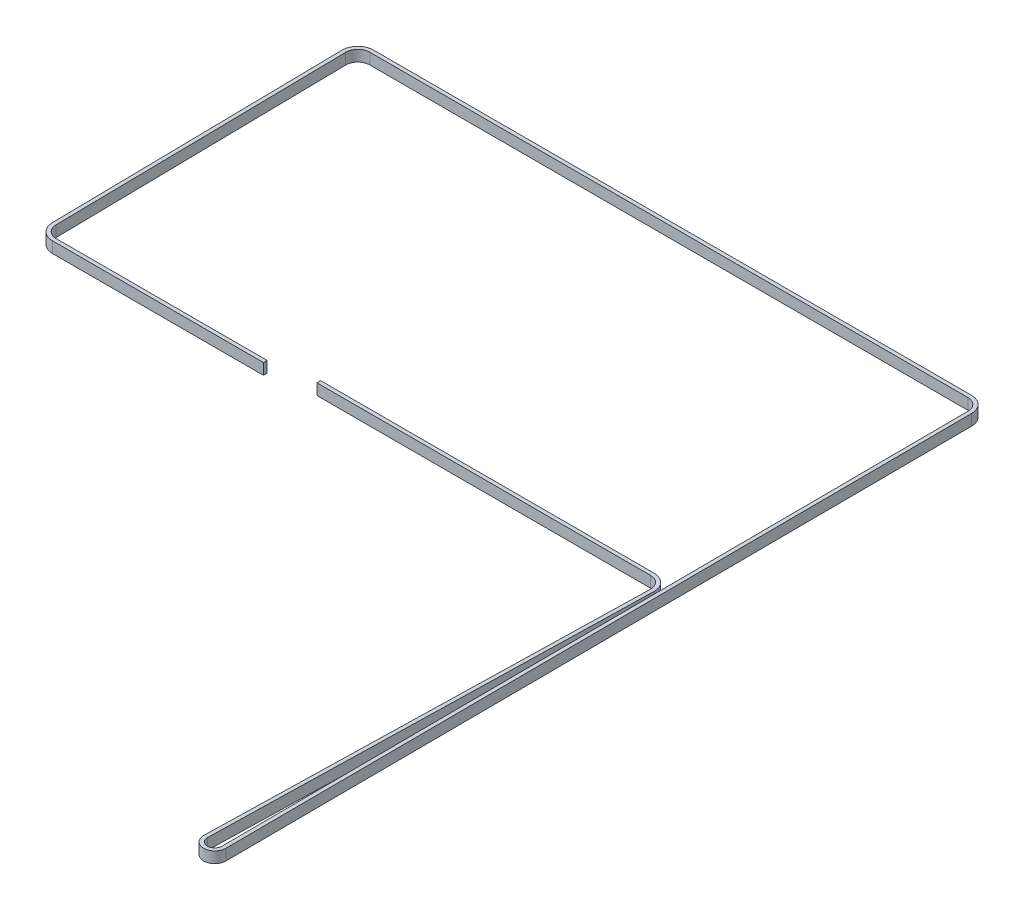
ISO-10303-21;
HEADER;
FILE_DESCRIPTION(('STEP AP214'),'2;1');
FILE_NAME('part.step','',(''),(''),'','','');
FILE_SCHEMA(('AUTOMOTIVE_DESIGN { 1 0 10303 214 1 1 1 1 }'));
ENDSEC;
DATA;
#1=APPLICATION_CONTEXT('core data for automotive mechanical design processes');
#2=APPLICATION_PROTOCOL_DEFINITION('international standard','automotive_design',2000,#1);
#3=PRODUCT_CONTEXT('',#1,'mechanical');
#4=PRODUCT('Part','Part','',(#3));
#5=PRODUCT_RELATED_PRODUCT_CATEGORY('part','',(#4));
#6=PRODUCT_DEFINITION_FORMATION('','',#4);
#7=PRODUCT_DEFINITION_CONTEXT('part definition',#1,'design');
#8=PRODUCT_DEFINITION('design','',#6,#7);
#9=PRODUCT_DEFINITION_SHAPE('','',#8);
#10=(LENGTH_UNIT() NAMED_UNIT(*) SI_UNIT(.MILLI.,.METRE.));
#11=(NAMED_UNIT(*) PLANE_ANGLE_UNIT() SI_UNIT($,.RADIAN.));
#12=(NAMED_UNIT(*) SI_UNIT($,.STERADIAN.) SOLID_ANGLE_UNIT());
#13=UNCERTAINTY_MEASURE_WITH_UNIT(LENGTH_MEASURE(1.E-05),#10,'distance_accuracy_value','');
#14=(GEOMETRIC_REPRESENTATION_CONTEXT(3) GLOBAL_UNCERTAINTY_ASSIGNED_CONTEXT((#13)) GLOBAL_UNIT_ASSIGNED_CONTEXT((#10,
#11,#12)) REPRESENTATION_CONTEXT('',''));
#15=CARTESIAN_POINT('',(0.,0.,0.));
#16=DIRECTION('',(0.,0.,1.));
#17=DIRECTION('',(1.,0.,0.));
#18=AXIS2_PLACEMENT_3D('',#15,#16,#17);
#19=CARTESIAN_POINT('',(159.5,493.,-24.0773769046461));
#20=DIRECTION('',(0.,0.,-1.));
#21=DIRECTION('',(-1.,0.,0.));
#22=AXIS2_PLACEMENT_3D('',#19,#20,#21);
#23=PLANE('',#22);
#24=DIRECTION('',(0.,1.,0.));
#25=VECTOR('',#24,1.);
#26=CARTESIAN_POINT('',(-21.1924852746074,493.,-24.0773769046461));
#27=LINE('',#26,#25);
#28=CARTESIAN_POINT('',(-21.1924852746074,493.,-24.0773769046461));
#29=VERTEX_POINT('',#28);
#30=CARTESIAN_POINT('',(-21.1924852746074,499.,-24.0773769046461));
#31=VERTEX_POINT('',#30);
#32=EDGE_CURVE('E36',#29,#31,#27,.T.);
#33=ORIENTED_EDGE('',*,*,#32,.T.);
#34=DIRECTION('',(-1.,0.,0.));
#35=VECTOR('',#34,1.);
#36=CARTESIAN_POINT('',(159.5,499.,-24.0773769046461));
#37=LINE('',#36,#35);
#38=CARTESIAN_POINT('',(159.5,499.,-24.0773769046461));
#39=VERTEX_POINT('',#38);
#40=EDGE_CURVE('E193',#39,#31,#37,.T.);
#41=ORIENTED_EDGE('',*,*,#40,.F.);
#42=DIRECTION('',(0.,1.,0.));
#43=VECTOR('',#42,1.);
#44=CARTESIAN_POINT('',(159.5,493.,-24.0773769046461));
#45=LINE('',#44,#43);
#46=CARTESIAN_POINT('',(159.5,493.,-24.0773769046461));
#47=VERTEX_POINT('',#46);
#48=EDGE_CURVE('E11',#47,#39,#45,.T.);
#49=ORIENTED_EDGE('',*,*,#48,.F.);
#50=DIRECTION('',(-1.,0.,0.));
#51=VECTOR('',#50,1.);
#52=CARTESIAN_POINT('',(159.5,493.,-24.0773769046461));
#53=LINE('',#52,#51);
#54=EDGE_CURVE('E194',#47,#29,#53,.T.);
#55=ORIENTED_EDGE('',*,*,#54,.T.);
#56=EDGE_LOOP('',(#33,#41,#49,#55));
#57=FACE_BOUND('',#56,.T.);
#58=ADVANCED_FACE('F33',(#57),#23,.T.);
#59=CARTESIAN_POINT('',(159.5,493.,-15.5773769046461));
#60=DIRECTION('',(0.,1.,0.));
#61=DIRECTION('',(0.,0.,1.));
#62=AXIS2_PLACEMENT_3D('',#59,#60,#61);
#63=CYLINDRICAL_SURFACE('',#62,8.49999999999999);
#64=ORIENTED_EDGE('',*,*,#48,.T.);
#65=CARTESIAN_POINT('',(159.5,499.,-15.5773769046461));
#66=DIRECTION('',(0.,1.,0.));
#67=DIRECTION('',(1.,0.,0.));
#68=AXIS2_PLACEMENT_3D('',#65,#66,#67);
#69=CIRCLE('',#68,8.49999999999999);
#70=CARTESIAN_POINT('',(167.997701071009,499.,-15.3796991168761));
#71=VERTEX_POINT('',#70);
#72=EDGE_CURVE('E208',#71,#39,#69,.T.);
#73=ORIENTED_EDGE('',*,*,#72,.F.);
#74=DIRECTION('',(0.,1.,0.));
#75=VECTOR('',#74,1.);
#76=CARTESIAN_POINT('',(167.997701071009,493.,-15.3796991168761));
#77=LINE('',#76,#75);
#78=CARTESIAN_POINT('',(167.997701071009,493.,-15.3796991168761));
#79=VERTEX_POINT('',#78);
#80=EDGE_CURVE('E41',#79,#71,#77,.T.);
#81=ORIENTED_EDGE('',*,*,#80,.F.);
#82=CARTESIAN_POINT('',(159.5,493.,-15.5773769046461));
#83=DIRECTION('',(0.,1.,0.));
#84=DIRECTION('',(1.,0.,0.));
#85=AXIS2_PLACEMENT_3D('',#82,#83,#84);
#86=CIRCLE('',#85,8.49999999999999);
#87=EDGE_CURVE('E199',#79,#47,#86,.T.);
#88=ORIENTED_EDGE('',*,*,#87,.T.);
#89=EDGE_LOOP('',(#64,#73,#81,#88));
#90=FACE_BOUND('',#89,.T.);
#91=ADVANCED_FACE('F467',(#90),#63,.T.);
#92=CARTESIAN_POINT('',(167.997701071009,493.,-15.3796991168761));
#93=DIRECTION('',(0.999729537765729,0.,0.0232562103258823));
#94=DIRECTION('',(0.0232562103258823,0.,-0.999729537765729));
#95=AXIS2_PLACEMENT_3D('',#92,#93,#94);
#96=PLANE('',#95);
#97=ORIENTED_EDGE('',*,*,#80,.T.);
#98=DIRECTION('',(0.0232562103258823,0.,-0.999729537765729));
#99=VECTOR('',#98,1.);
#100=CARTESIAN_POINT('',(167.997701071009,499.,-15.3796991168761));
#101=LINE('',#100,#99);
#102=CARTESIAN_POINT('',(162.501081848937,499.,220.906975158696));
#103=VERTEX_POINT('',#102);
#104=EDGE_CURVE('E273',#103,#71,#101,.T.);
#105=ORIENTED_EDGE('',*,*,#104,.F.);
#106=DIRECTION('',(0.,1.,0.));
#107=VECTOR('',#106,1.);
#108=CARTESIAN_POINT('',(162.501081848937,493.,220.906975158696));
#109=LINE('',#108,#107);
#110=CARTESIAN_POINT('',(162.501081848937,493.,220.906975158696));
#111=VERTEX_POINT('',#110);
#112=EDGE_CURVE('E331',#111,#103,#109,.T.);
#113=ORIENTED_EDGE('',*,*,#112,.F.);
#114=DIRECTION('',(0.0232562103258823,0.,-0.999729537765729));
#115=VECTOR('',#114,1.);
#116=CARTESIAN_POINT('',(167.997701071009,493.,-15.3796991168761));
#117=LINE('',#116,#115);
#118=EDGE_CURVE('E327',#111,#79,#117,.T.);
#119=ORIENTED_EDGE('',*,*,#118,.T.);
#120=EDGE_LOOP('',(#97,#105,#113,#119));
#121=FACE_BOUND('',#120,.T.);
#122=ADVANCED_FACE('F465',(#121),#96,.T.);
#123=CARTESIAN_POINT('',(166.5,493.,221.));
#124=DIRECTION('',(0.,1.,0.));
#125=DIRECTION('',(0.,0.,1.));
#126=AXIS2_PLACEMENT_3D('',#123,#124,#125);
#127=CYLINDRICAL_SURFACE('',#126,4.00000000000003);
#128=ORIENTED_EDGE('',*,*,#112,.T.);
#129=CARTESIAN_POINT('',(166.5,499.,221.));
#130=DIRECTION('',(0.,1.,0.));
#131=DIRECTION('',(1.,0.,0.));
#132=AXIS2_PLACEMENT_3D('',#129,#130,#131);
#133=CIRCLE('',#132,4.00000000000003);
#134=CARTESIAN_POINT('',(170.499951469268,499.,220.980296104405));
#135=VERTEX_POINT('',#134);
#136=EDGE_CURVE('E270',#135,#103,#133,.F.);
#137=ORIENTED_EDGE('',*,*,#136,.F.);
#138=DIRECTION('',(0.,1.,0.));
#139=VECTOR('',#138,1.);
#140=CARTESIAN_POINT('',(170.499951469268,493.,220.980296104405));
#141=LINE('',#140,#139);
#142=CARTESIAN_POINT('',(170.499951469268,493.,220.980296104405));
#143=VERTEX_POINT('',#142);
#144=EDGE_CURVE('E333',#143,#135,#141,.T.);
#145=ORIENTED_EDGE('',*,*,#144,.F.);
#146=CARTESIAN_POINT('',(166.5,493.,221.));
#147=DIRECTION('',(0.,1.,0.));
#148=DIRECTION('',(1.,0.,0.));
#149=AXIS2_PLACEMENT_3D('',#146,#147,#148);
#150=CIRCLE('',#149,4.00000000000003);
#151=EDGE_CURVE('E324',#143,#111,#150,.F.);
#152=ORIENTED_EDGE('',*,*,#151,.T.);
#153=EDGE_LOOP('',(#128,#137,#145,#152));
#154=FACE_BOUND('',#153,.T.);
#155=ADVANCED_FACE('F463',(#154),#127,.F.);
#156=CARTESIAN_POINT('',(170.499951469268,493.,220.980296104405));
#157=DIRECTION('',(-0.999987867316973,0.,0.00492597389883358));
#158=DIRECTION('',(0.00492597389883357,0.,0.999987867316973));
#159=AXIS2_PLACEMENT_3D('',#156,#157,#158);
#160=PLANE('',#159);
#161=ORIENTED_EDGE('',*,*,#144,.T.);
#162=DIRECTION('',(0.00492597389883357,0.,0.999987867316973));
#163=VECTOR('',#162,1.);
#164=CARTESIAN_POINT('',(170.499951469268,499.,220.980296104405));
#165=LINE('',#164,#163);
#166=CARTESIAN_POINT('',(168.49992113756,499.,-185.032018830342));
#167=VERTEX_POINT('',#166);
#168=EDGE_CURVE('E267',#167,#135,#165,.T.);
#169=ORIENTED_EDGE('',*,*,#168,.F.);
#170=DIRECTION('',(0.,1.,0.));
#171=VECTOR('',#170,1.);
#172=CARTESIAN_POINT('',(168.49992113756,493.,-185.032018830342));
#173=LINE('',#172,#171);
#174=CARTESIAN_POINT('',(168.49992113756,493.,-185.032018830342));
#175=VERTEX_POINT('',#174);
#176=EDGE_CURVE('E335',#175,#167,#173,.T.);
#177=ORIENTED_EDGE('',*,*,#176,.F.);
#178=DIRECTION('',(0.00492597389883357,0.,0.999987867316973));
#179=VECTOR('',#178,1.);
#180=CARTESIAN_POINT('',(170.499951469268,493.,220.980296104405));
#181=LINE('',#180,#179);
#182=EDGE_CURVE('E321',#175,#143,#181,.T.);
#183=ORIENTED_EDGE('',*,*,#182,.T.);
#184=EDGE_LOOP('',(#161,#169,#177,#183));
#185=FACE_BOUND('',#184,.T.);
#186=ADVANCED_FACE('F458',(#185),#160,.T.);
#187=CARTESIAN_POINT('',(162.,493.,-185.));
#188=DIRECTION('',(0.,1.,0.));
#189=DIRECTION('',(0.,0.,1.));
#190=AXIS2_PLACEMENT_3D('',#187,#188,#189);
#191=CYLINDRICAL_SURFACE('',#190,6.49999999999999);
#192=ORIENTED_EDGE('',*,*,#176,.T.);
#193=CARTESIAN_POINT('',(162.,499.,-185.));
#194=DIRECTION('',(0.,1.,0.));
#195=DIRECTION('',(1.,0.,0.));
#196=AXIS2_PLACEMENT_3D('',#193,#194,#195);
#197=CIRCLE('',#196,6.49999999999999);
#198=CARTESIAN_POINT('',(162.,499.,-191.5));
#199=VERTEX_POINT('',#198);
#200=EDGE_CURVE('E264',#199,#167,#197,.F.);
#201=ORIENTED_EDGE('',*,*,#200,.F.);
#202=DIRECTION('',(0.,1.,0.));
#203=VECTOR('',#202,1.);
#204=CARTESIAN_POINT('',(162.,493.,-191.5));
#205=LINE('',#204,#203);
#206=CARTESIAN_POINT('',(162.,493.,-191.5));
#207=VERTEX_POINT('',#206);
#208=EDGE_CURVE('E337',#207,#199,#205,.T.);
#209=ORIENTED_EDGE('',*,*,#208,.F.);
#210=CARTESIAN_POINT('',(162.,493.,-185.));
#211=DIRECTION('',(0.,1.,0.));
#212=DIRECTION('',(1.,0.,0.));
#213=AXIS2_PLACEMENT_3D('',#210,#211,#212);
#214=CIRCLE('',#213,6.49999999999999);
#215=EDGE_CURVE('E318',#207,#175,#214,.F.);
#216=ORIENTED_EDGE('',*,*,#215,.T.);
#217=EDGE_LOOP('',(#192,#201,#209,#216));
#218=FACE_BOUND('',#217,.T.);
#219=ADVANCED_FACE('F453',(#218),#191,.F.);
#220=CARTESIAN_POINT('',(162.,493.,-191.5));
#221=DIRECTION('',(0.,0.,1.));
#222=DIRECTION('',(1.,0.,0.));
#223=AXIS2_PLACEMENT_3D('',#220,#221,#222);
#224=PLANE('',#223);
#225=ORIENTED_EDGE('',*,*,#208,.T.);
#226=DIRECTION('',(1.,0.,0.));
#227=VECTOR('',#226,1.);
#228=CARTESIAN_POINT('',(162.,499.,-191.5));
#229=LINE('',#228,#227);
#230=CARTESIAN_POINT('',(-162.,499.,-191.5));
#231=VERTEX_POINT('',#230);
#232=EDGE_CURVE('E261',#231,#199,#229,.T.);
#233=ORIENTED_EDGE('',*,*,#232,.F.);
#234=DIRECTION('',(0.,1.,0.));
#235=VECTOR('',#234,1.);
#236=CARTESIAN_POINT('',(-162.,493.,-191.5));
#237=LINE('',#236,#235);
#238=CARTESIAN_POINT('',(-162.,493.,-191.5));
#239=VERTEX_POINT('',#238);
#240=EDGE_CURVE('E339',#239,#231,#237,.T.);
#241=ORIENTED_EDGE('',*,*,#240,.F.);
#242=DIRECTION('',(1.,0.,0.));
#243=VECTOR('',#242,1.);
#244=CARTESIAN_POINT('',(162.,493.,-191.5));
#245=LINE('',#244,#243);
#246=EDGE_CURVE('E315',#239,#207,#245,.T.);
#247=ORIENTED_EDGE('',*,*,#246,.T.);
#248=EDGE_LOOP('',(#225,#233,#241,#247));
#249=FACE_BOUND('',#248,.T.);
#250=ADVANCED_FACE('F451',(#249),#224,.T.);
#251=CARTESIAN_POINT('',(-162.,493.,-185.));
#252=DIRECTION('',(0.,1.,0.));
#253=DIRECTION('',(0.,0.,1.));
#254=AXIS2_PLACEMENT_3D('',#251,#252,#253);
#255=CYLINDRICAL_SURFACE('',#254,6.49999999999999);
#256=ORIENTED_EDGE('',*,*,#240,.T.);
#257=CARTESIAN_POINT('',(-162.,499.,-185.));
#258=DIRECTION('',(0.,1.,0.));
#259=DIRECTION('',(1.,0.,0.));
#260=AXIS2_PLACEMENT_3D('',#257,#258,#259);
#261=CIRCLE('',#260,6.49999999999999);
#262=CARTESIAN_POINT('',(-168.499200932647,499.,-184.898082204294));
#263=VERTEX_POINT('',#262);
#264=EDGE_CURVE('E258',#263,#231,#261,.F.);
#265=ORIENTED_EDGE('',*,*,#264,.F.);
#266=DIRECTION('',(0.,1.,0.));
#267=VECTOR('',#266,1.);
#268=CARTESIAN_POINT('',(-168.499200932647,493.,-184.898082204294));
#269=LINE('',#268,#267);
#270=CARTESIAN_POINT('',(-168.499200932647,493.,-184.898082204294));
#271=VERTEX_POINT('',#270);
#272=EDGE_CURVE('E341',#271,#263,#269,.T.);
#273=ORIENTED_EDGE('',*,*,#272,.F.);
#274=CARTESIAN_POINT('',(-162.,493.,-185.));
#275=DIRECTION('',(0.,1.,0.));
#276=DIRECTION('',(1.,0.,0.));
#277=AXIS2_PLACEMENT_3D('',#274,#275,#276);
#278=CIRCLE('',#277,6.49999999999999);
#279=EDGE_CURVE('E312',#271,#239,#278,.F.);
#280=ORIENTED_EDGE('',*,*,#279,.T.);
#281=EDGE_LOOP('',(#256,#265,#273,#280));
#282=FACE_BOUND('',#281,.T.);
#283=ADVANCED_FACE('F446',(#282),#255,.F.);
#284=CARTESIAN_POINT('',(-168.499200932647,493.,-184.898082204294));
#285=DIRECTION('',(0.999877066561062,0.,-0.0156796608779125));
#286=DIRECTION('',(-0.0156796608779125,0.,-0.999877066561062));
#287=AXIS2_PLACEMENT_3D('',#284,#285,#286);
#288=PLANE('',#287);
#289=ORIENTED_EDGE('',*,*,#272,.T.);
#290=DIRECTION('',(-0.0156796608779125,0.,-0.999877066561062));
#291=VECTOR('',#290,1.);
#292=CARTESIAN_POINT('',(-168.499200932647,499.,-184.898082204294));
#293=LINE('',#292,#291);
#294=CARTESIAN_POINT('',(-165.999200932647,499.,-25.4754591089396));
#295=VERTEX_POINT('',#294);
#296=EDGE_CURVE('E255',#295,#263,#293,.T.);
#297=ORIENTED_EDGE('',*,*,#296,.F.);
#298=DIRECTION('',(0.,1.,0.));
#299=VECTOR('',#298,1.);
#300=CARTESIAN_POINT('',(-165.999200932647,493.,-25.4754591089396));
#301=LINE('',#300,#299);
#302=CARTESIAN_POINT('',(-165.999200932647,493.,-25.4754591089396));
#303=VERTEX_POINT('',#302);
#304=EDGE_CURVE('E343',#303,#295,#301,.T.);
#305=ORIENTED_EDGE('',*,*,#304,.F.);
#306=DIRECTION('',(-0.0156796608779125,0.,-0.999877066561062));
#307=VECTOR('',#306,1.);
#308=CARTESIAN_POINT('',(-168.499200932647,493.,-184.898082204294));
#309=LINE('',#308,#307);
#310=EDGE_CURVE('E309',#303,#271,#309,.T.);
#311=ORIENTED_EDGE('',*,*,#310,.T.);
#312=EDGE_LOOP('',(#289,#297,#305,#311));
#313=FACE_BOUND('',#312,.T.);
#314=ADVANCED_FACE('F439',(#313),#288,.T.);
#315=CARTESIAN_POINT('',(-159.5,493.,-25.577376904646));
#316=DIRECTION('',(0.,1.,0.));
#317=DIRECTION('',(0.,0.,1.));
#318=AXIS2_PLACEMENT_3D('',#315,#316,#317);
#319=CYLINDRICAL_SURFACE('',#318,6.5);
#320=ORIENTED_EDGE('',*,*,#304,.T.);
#321=CARTESIAN_POINT('',(-159.5,499.,-25.577376904646));
#322=DIRECTION('',(0.,1.,0.));
#323=DIRECTION('',(1.,0.,0.));
#324=AXIS2_PLACEMENT_3D('',#321,#322,#323);
#325=CIRCLE('',#324,6.5);
#326=CARTESIAN_POINT('',(-159.5,499.,-19.077376904646));
#327=VERTEX_POINT('',#326);
#328=EDGE_CURVE('E252',#327,#295,#325,.F.);
#329=ORIENTED_EDGE('',*,*,#328,.F.);
#330=DIRECTION('',(0.,1.,0.));
#331=VECTOR('',#330,1.);
#332=CARTESIAN_POINT('',(-159.5,493.,-19.077376904646));
#333=LINE('',#332,#331);
#334=CARTESIAN_POINT('',(-159.5,493.,-19.077376904646));
#335=VERTEX_POINT('',#334);
#336=EDGE_CURVE('E345',#335,#327,#333,.T.);
#337=ORIENTED_EDGE('',*,*,#336,.F.);
#338=CARTESIAN_POINT('',(-159.5,493.,-25.577376904646));
#339=DIRECTION('',(0.,1.,0.));
#340=DIRECTION('',(1.,0.,0.));
#341=AXIS2_PLACEMENT_3D('',#338,#339,#340);
#342=CIRCLE('',#341,6.5);
#343=EDGE_CURVE('E306',#335,#303,#342,.F.);
#344=ORIENTED_EDGE('',*,*,#343,.T.);
#345=EDGE_LOOP('',(#320,#329,#337,#344));
#346=FACE_BOUND('',#345,.T.);
#347=ADVANCED_FACE('F435',(#346),#319,.F.);
#348=CARTESIAN_POINT('',(-159.5,493.,-19.077376904646));
#349=DIRECTION('',(0.,0.,-1.));
#350=DIRECTION('',(-1.,0.,0.));
#351=AXIS2_PLACEMENT_3D('',#348,#349,#350);
#352=PLANE('',#351);
#353=ORIENTED_EDGE('',*,*,#336,.T.);
#354=DIRECTION('',(1.,0.,0.));
#355=VECTOR('',#354,1.);
#356=CARTESIAN_POINT('',(-159.5,499.,-19.077376904646));
#357=LINE('',#356,#355);
#358=CARTESIAN_POINT('',(-45.1924852746074,499.,-19.077376904646));
#359=VERTEX_POINT('',#358);
#360=EDGE_CURVE('E249',#359,#327,#357,.F.);
#361=ORIENTED_EDGE('',*,*,#360,.F.);
#362=DIRECTION('',(0.,1.,0.));
#363=VECTOR('',#362,1.);
#364=CARTESIAN_POINT('',(-45.1924852746074,493.,-19.077376904646));
#365=LINE('',#364,#363);
#366=CARTESIAN_POINT('',(-45.1924852746074,493.,-19.077376904646));
#367=VERTEX_POINT('',#366);
#368=EDGE_CURVE('E347',#367,#359,#365,.T.);
#369=ORIENTED_EDGE('',*,*,#368,.F.);
#370=DIRECTION('',(1.,0.,0.));
#371=VECTOR('',#370,1.);
#372=CARTESIAN_POINT('',(-159.5,493.,-19.077376904646));
#373=LINE('',#372,#371);
#374=EDGE_CURVE('E303',#367,#335,#373,.F.);
#375=ORIENTED_EDGE('',*,*,#374,.T.);
#376=EDGE_LOOP('',(#353,#361,#369,#375));
#377=FACE_BOUND('',#376,.T.);
#378=ADVANCED_FACE('F431',(#377),#352,.T.);
#379=CARTESIAN_POINT('',(-45.1924852746074,493.,-19.077376904646));
#380=DIRECTION('',(-1.,0.,0.));
#381=DIRECTION('',(0.,0.,1.));
#382=AXIS2_PLACEMENT_3D('',#379,#380,#381);
#383=PLANE('',#382);
#384=ORIENTED_EDGE('',*,*,#368,.T.);
#385=DIRECTION('',(0.,0.,1.));
#386=VECTOR('',#385,1.);
#387=CARTESIAN_POINT('',(-45.1924852746074,499.,-19.077376904646));
#388=LINE('',#387,#386);
#389=CARTESIAN_POINT('',(-45.1924852746074,499.,-17.077376904646));
#390=VERTEX_POINT('',#389);
#391=EDGE_CURVE('E246',#359,#390,#388,.T.);
#392=ORIENTED_EDGE('',*,*,#391,.T.);
#393=DIRECTION('',(0.,1.,0.));
#394=VECTOR('',#393,1.);
#395=CARTESIAN_POINT('',(-45.1924852746074,493.,-17.077376904646));
#396=LINE('',#395,#394);
#397=CARTESIAN_POINT('',(-45.1924852746074,493.,-17.077376904646));
#398=VERTEX_POINT('',#397);
#399=EDGE_CURVE('E349',#398,#390,#396,.T.);
#400=ORIENTED_EDGE('',*,*,#399,.F.);
#401=DIRECTION('',(0.,0.,1.));
#402=VECTOR('',#401,1.);
#403=CARTESIAN_POINT('',(-45.1924852746074,493.,-19.077376904646));
#404=LINE('',#403,#402);
#405=EDGE_CURVE('E301',#367,#398,#404,.T.);
#406=ORIENTED_EDGE('',*,*,#405,.F.);
#407=EDGE_LOOP('',(#384,#392,#400,#406));
#408=FACE_BOUND('',#407,.T.);
#409=ADVANCED_FACE('F426',(#408),#383,.F.);
#410=CARTESIAN_POINT('',(-159.5,493.,-17.077376904646));
#411=DIRECTION('',(0.,0.,-1.));
#412=DIRECTION('',(-1.,0.,0.));
#413=AXIS2_PLACEMENT_3D('',#410,#411,#412);
#414=PLANE('',#413);
#415=ORIENTED_EDGE('',*,*,#399,.T.);
#416=DIRECTION('',(-1.,0.,0.));
#417=VECTOR('',#416,1.);
#418=CARTESIAN_POINT('',(-159.5,499.,-17.077376904646));
#419=LINE('',#418,#417);
#420=CARTESIAN_POINT('',(-159.5,499.,-17.077376904646));
#421=VERTEX_POINT('',#420);
#422=EDGE_CURVE('E243',#390,#421,#419,.T.);
#423=ORIENTED_EDGE('',*,*,#422,.T.);
#424=DIRECTION('',(0.,1.,0.));
#425=VECTOR('',#424,1.);
#426=CARTESIAN_POINT('',(-159.5,493.,-17.077376904646));
#427=LINE('',#426,#425);
#428=CARTESIAN_POINT('',(-159.5,493.,-17.077376904646));
#429=VERTEX_POINT('',#428);
#430=EDGE_CURVE('E351',#429,#421,#427,.T.);
#431=ORIENTED_EDGE('',*,*,#430,.F.);
#432=DIRECTION('',(-1.,0.,0.));
#433=VECTOR('',#432,1.);
#434=CARTESIAN_POINT('',(-159.5,493.,-17.077376904646));
#435=LINE('',#434,#433);
#436=EDGE_CURVE('E299',#398,#429,#435,.T.);
#437=ORIENTED_EDGE('',*,*,#436,.F.);
#438=EDGE_LOOP('',(#415,#423,#431,#437));
#439=FACE_BOUND('',#438,.T.);
#440=ADVANCED_FACE('F422',(#439),#414,.F.);
#441=CARTESIAN_POINT('',(-159.5,493.,-25.577376904646));
#442=DIRECTION('',(0.,1.,0.));
#443=DIRECTION('',(0.,0.,1.));
#444=AXIS2_PLACEMENT_3D('',#441,#442,#443);
#445=CYLINDRICAL_SURFACE('',#444,8.5);
#446=ORIENTED_EDGE('',*,*,#430,.T.);
#447=CARTESIAN_POINT('',(-159.5,499.,-25.577376904646));
#448=DIRECTION('',(0.,-1.,0.));
#449=DIRECTION('',(0.,0.,1.));
#450=AXIS2_PLACEMENT_3D('',#447,#448,#449);
#451=CIRCLE('',#450,8.5);
#452=CARTESIAN_POINT('',(-167.998955065769,499.,-25.4440997871837));
#453=VERTEX_POINT('',#452);
#454=EDGE_CURVE('E240',#421,#453,#451,.T.);
#455=ORIENTED_EDGE('',*,*,#454,.T.);
#456=DIRECTION('',(0.,1.,0.));
#457=VECTOR('',#456,1.);
#458=CARTESIAN_POINT('',(-167.998955065769,493.,-25.4440997871837));
#459=LINE('',#458,#457);
#460=CARTESIAN_POINT('',(-167.998955065769,493.,-25.4440997871837));
#461=VERTEX_POINT('',#460);
#462=EDGE_CURVE('E353',#461,#453,#459,.T.);
#463=ORIENTED_EDGE('',*,*,#462,.F.);
#464=CARTESIAN_POINT('',(-159.5,493.,-25.577376904646));
#465=DIRECTION('',(0.,-1.,0.));
#466=DIRECTION('',(0.,0.,1.));
#467=AXIS2_PLACEMENT_3D('',#464,#465,#466);
#468=CIRCLE('',#467,8.5);
#469=EDGE_CURVE('E297',#429,#461,#468,.T.);
#470=ORIENTED_EDGE('',*,*,#469,.F.);
#471=EDGE_LOOP('',(#446,#455,#463,#470));
#472=FACE_BOUND('',#471,.T.);
#473=ADVANCED_FACE('F417',(#472),#445,.T.);
#474=CARTESIAN_POINT('',(-170.498955065769,493.,-184.866722882538));
#475=DIRECTION('',(0.999877066561062,0.,-0.0156796608779125));
#476=DIRECTION('',(-0.0156796608779125,0.,-0.999877066561062));
#477=AXIS2_PLACEMENT_3D('',#474,#475,#476);
#478=PLANE('',#477);
#479=ORIENTED_EDGE('',*,*,#462,.T.);
#480=DIRECTION('',(-0.0156796608779125,0.,-0.999877066561062));
#481=VECTOR('',#480,1.);
#482=CARTESIAN_POINT('',(-170.498955065769,499.,-184.866722882538));
#483=LINE('',#482,#481);
#484=CARTESIAN_POINT('',(-170.498955065769,499.,-184.866722882538));
#485=VERTEX_POINT('',#484);
#486=EDGE_CURVE('E237',#453,#485,#483,.T.);
#487=ORIENTED_EDGE('',*,*,#486,.T.);
#488=DIRECTION('',(0.,1.,0.));
#489=VECTOR('',#488,1.);
#490=CARTESIAN_POINT('',(-170.498955065769,493.,-184.866722882538));
#491=LINE('',#490,#489);
#492=CARTESIAN_POINT('',(-170.498955065769,493.,-184.866722882538));
#493=VERTEX_POINT('',#492);
#494=EDGE_CURVE('E355',#493,#485,#491,.T.);
#495=ORIENTED_EDGE('',*,*,#494,.F.);
#496=DIRECTION('',(-0.0156796608779125,0.,-0.999877066561062));
#497=VECTOR('',#496,1.);
#498=CARTESIAN_POINT('',(-170.498955065769,493.,-184.866722882538));
#499=LINE('',#498,#497);
#500=EDGE_CURVE('E295',#461,#493,#499,.T.);
#501=ORIENTED_EDGE('',*,*,#500,.F.);
#502=EDGE_LOOP('',(#479,#487,#495,#501));
#503=FACE_BOUND('',#502,.T.);
#504=ADVANCED_FACE('F412',(#503),#478,.F.);
#505=CARTESIAN_POINT('',(-162.,493.,-185.));
#506=DIRECTION('',(0.,1.,0.));
#507=DIRECTION('',(0.,0.,1.));
#508=AXIS2_PLACEMENT_3D('',#505,#506,#507);
#509=CYLINDRICAL_SURFACE('',#508,8.49999999999999);
#510=ORIENTED_EDGE('',*,*,#494,.T.);
#511=CARTESIAN_POINT('',(-162.,499.,-185.));
#512=DIRECTION('',(0.,-1.,0.));
#513=DIRECTION('',(0.,0.,1.));
#514=AXIS2_PLACEMENT_3D('',#511,#512,#513);
#515=CIRCLE('',#514,8.49999999999999);
#516=CARTESIAN_POINT('',(-162.,499.,-193.5));
#517=VERTEX_POINT('',#516);
#518=EDGE_CURVE('E234',#485,#517,#515,.T.);
#519=ORIENTED_EDGE('',*,*,#518,.T.);
#520=DIRECTION('',(0.,1.,0.));
#521=VECTOR('',#520,1.);
#522=CARTESIAN_POINT('',(-162.,493.,-193.5));
#523=LINE('',#522,#521);
#524=CARTESIAN_POINT('',(-162.,493.,-193.5));
#525=VERTEX_POINT('',#524);
#526=EDGE_CURVE('E357',#525,#517,#523,.T.);
#527=ORIENTED_EDGE('',*,*,#526,.F.);
#528=CARTESIAN_POINT('',(-162.,493.,-185.));
#529=DIRECTION('',(0.,-1.,0.));
#530=DIRECTION('',(0.,0.,1.));
#531=AXIS2_PLACEMENT_3D('',#528,#529,#530);
#532=CIRCLE('',#531,8.49999999999999);
#533=EDGE_CURVE('E293',#493,#525,#532,.T.);
#534=ORIENTED_EDGE('',*,*,#533,.F.);
#535=EDGE_LOOP('',(#510,#519,#527,#534));
#536=FACE_BOUND('',#535,.T.);
#537=ADVANCED_FACE('F407',(#536),#509,.T.);
#538=CARTESIAN_POINT('',(162.,493.,-193.5));
#539=DIRECTION('',(0.,0.,1.));
#540=DIRECTION('',(1.,0.,0.));
#541=AXIS2_PLACEMENT_3D('',#538,#539,#540);
#542=PLANE('',#541);
#543=ORIENTED_EDGE('',*,*,#526,.T.);
#544=DIRECTION('',(1.,0.,0.));
#545=VECTOR('',#544,1.);
#546=CARTESIAN_POINT('',(162.,499.,-193.5));
#547=LINE('',#546,#545);
#548=CARTESIAN_POINT('',(162.,499.,-193.5));
#549=VERTEX_POINT('',#548);
#550=EDGE_CURVE('E231',#517,#549,#547,.T.);
#551=ORIENTED_EDGE('',*,*,#550,.T.);
#552=DIRECTION('',(0.,1.,0.));
#553=VECTOR('',#552,1.);
#554=CARTESIAN_POINT('',(162.,493.,-193.5));
#555=LINE('',#554,#553);
#556=CARTESIAN_POINT('',(162.,493.,-193.5));
#557=VERTEX_POINT('',#556);
#558=EDGE_CURVE('E359',#557,#549,#555,.T.);
#559=ORIENTED_EDGE('',*,*,#558,.F.);
#560=DIRECTION('',(1.,0.,0.));
#561=VECTOR('',#560,1.);
#562=CARTESIAN_POINT('',(162.,493.,-193.5));
#563=LINE('',#562,#561);
#564=EDGE_CURVE('E291',#525,#557,#563,.T.);
#565=ORIENTED_EDGE('',*,*,#564,.F.);
#566=EDGE_LOOP('',(#543,#551,#559,#565));
#567=FACE_BOUND('',#566,.T.);
#568=ADVANCED_FACE('F402',(#567),#542,.F.);
#569=CARTESIAN_POINT('',(162.,493.,-185.));
#570=DIRECTION('',(0.,1.,0.));
#571=DIRECTION('',(0.,0.,1.));
#572=AXIS2_PLACEMENT_3D('',#569,#570,#571);
#573=CYLINDRICAL_SURFACE('',#572,8.49999999999999);
#574=ORIENTED_EDGE('',*,*,#558,.T.);
#575=CARTESIAN_POINT('',(162.,499.,-185.));
#576=DIRECTION('',(0.,-1.,0.));
#577=DIRECTION('',(0.,0.,1.));
#578=AXIS2_PLACEMENT_3D('',#575,#576,#577);
#579=CIRCLE('',#578,8.49999999999999);
#580=CARTESIAN_POINT('',(170.499896872194,499.,-185.04187077814));
#581=VERTEX_POINT('',#580);
#582=EDGE_CURVE('E228',#549,#581,#579,.T.);
#583=ORIENTED_EDGE('',*,*,#582,.T.);
#584=DIRECTION('',(0.,1.,0.));
#585=VECTOR('',#584,1.);
#586=CARTESIAN_POINT('',(170.499896872194,493.,-185.04187077814));
#587=LINE('',#586,#585);
#588=CARTESIAN_POINT('',(170.499896872194,493.,-185.04187077814));
#589=VERTEX_POINT('',#588);
#590=EDGE_CURVE('E361',#589,#581,#587,.T.);
#591=ORIENTED_EDGE('',*,*,#590,.F.);
#592=CARTESIAN_POINT('',(162.,493.,-185.));
#593=DIRECTION('',(0.,-1.,0.));
#594=DIRECTION('',(0.,0.,1.));
#595=AXIS2_PLACEMENT_3D('',#592,#593,#594);
#596=CIRCLE('',#595,8.49999999999999);
#597=EDGE_CURVE('E289',#557,#589,#596,.T.);
#598=ORIENTED_EDGE('',*,*,#597,.F.);
#599=EDGE_LOOP('',(#574,#583,#591,#598));
#600=FACE_BOUND('',#599,.T.);
#601=ADVANCED_FACE('F397',(#600),#573,.T.);
#602=CARTESIAN_POINT('',(172.499927203902,493.,220.970444156607));
#603=DIRECTION('',(-0.999987867316973,0.,0.00492597389883358));
#604=DIRECTION('',(0.00492597389883357,0.,0.999987867316973));
#605=AXIS2_PLACEMENT_3D('',#602,#603,#604);
#606=PLANE('',#605);
#607=ORIENTED_EDGE('',*,*,#590,.T.);
#608=DIRECTION('',(0.00492597389883357,0.,0.999987867316973));
#609=VECTOR('',#608,1.);
#610=CARTESIAN_POINT('',(172.499927203902,499.,220.970444156607));
#611=LINE('',#610,#609);
#612=CARTESIAN_POINT('',(172.499927203902,499.,220.970444156607));
#613=VERTEX_POINT('',#612);
#614=EDGE_CURVE('E225',#581,#613,#611,.T.);
#615=ORIENTED_EDGE('',*,*,#614,.T.);
#616=DIRECTION('',(0.,1.,0.));
#617=VECTOR('',#616,1.);
#618=CARTESIAN_POINT('',(172.499927203902,493.,220.970444156607));
#619=LINE('',#618,#617);
#620=CARTESIAN_POINT('',(172.499927203902,493.,220.970444156607));
#621=VERTEX_POINT('',#620);
#622=EDGE_CURVE('E363',#621,#613,#619,.T.);
#623=ORIENTED_EDGE('',*,*,#622,.F.);
#624=DIRECTION('',(0.00492597389883357,0.,0.999987867316973));
#625=VECTOR('',#624,1.);
#626=CARTESIAN_POINT('',(172.499927203902,493.,220.970444156607));
#627=LINE('',#626,#625);
#628=EDGE_CURVE('E287',#589,#621,#627,.T.);
#629=ORIENTED_EDGE('',*,*,#628,.F.);
#630=EDGE_LOOP('',(#607,#615,#623,#629));
#631=FACE_BOUND('',#630,.T.);
#632=ADVANCED_FACE('F392',(#631),#606,.F.);
#633=CARTESIAN_POINT('',(166.5,493.,221.));
#634=DIRECTION('',(0.,1.,0.));
#635=DIRECTION('',(0.,0.,1.));
#636=AXIS2_PLACEMENT_3D('',#633,#634,#635);
#637=CYLINDRICAL_SURFACE('',#636,6.00000000000003);
#638=ORIENTED_EDGE('',*,*,#622,.T.);
#639=CARTESIAN_POINT('',(166.5,499.,221.));
#640=DIRECTION('',(0.,-1.,0.));
#641=DIRECTION('',(0.,0.,1.));
#642=AXIS2_PLACEMENT_3D('',#639,#640,#641);
#643=CIRCLE('',#642,6.00000000000003);
#644=CARTESIAN_POINT('',(160.501622773405,499.,220.860462738045));
#645=VERTEX_POINT('',#644);
#646=EDGE_CURVE('E222',#613,#645,#643,.T.);
#647=ORIENTED_EDGE('',*,*,#646,.T.);
#648=DIRECTION('',(0.,1.,0.));
#649=VECTOR('',#648,1.);
#650=CARTESIAN_POINT('',(160.501622773405,493.,220.860462738045));
#651=LINE('',#650,#649);
#652=CARTESIAN_POINT('',(160.501622773405,493.,220.860462738045));
#653=VERTEX_POINT('',#652);
#654=EDGE_CURVE('E365',#653,#645,#651,.T.);
#655=ORIENTED_EDGE('',*,*,#654,.F.);
#656=CARTESIAN_POINT('',(166.5,493.,221.));
#657=DIRECTION('',(0.,-1.,0.));
#658=DIRECTION('',(0.,0.,1.));
#659=AXIS2_PLACEMENT_3D('',#656,#657,#658);
#660=CIRCLE('',#659,6.00000000000003);
#661=EDGE_CURVE('E285',#621,#653,#660,.T.);
#662=ORIENTED_EDGE('',*,*,#661,.F.);
#663=EDGE_LOOP('',(#638,#647,#655,#662));
#664=FACE_BOUND('',#663,.T.);
#665=ADVANCED_FACE('F387',(#664),#637,.T.);
#666=CARTESIAN_POINT('',(165.998241995477,493.,-15.4262115375279));
#667=DIRECTION('',(0.999729537765729,0.,0.0232562103258823));
#668=DIRECTION('',(0.0232562103258823,0.,-0.999729537765729));
#669=AXIS2_PLACEMENT_3D('',#666,#667,#668);
#670=PLANE('',#669);
#671=ORIENTED_EDGE('',*,*,#654,.T.);
#672=DIRECTION('',(0.0232562103258823,0.,-0.999729537765729));
#673=VECTOR('',#672,1.);
#674=CARTESIAN_POINT('',(165.998241995477,499.,-15.4262115375279));
#675=LINE('',#674,#673);
#676=CARTESIAN_POINT('',(165.998241995477,499.,-15.4262115375279));
#677=VERTEX_POINT('',#676);
#678=EDGE_CURVE('E219',#645,#677,#675,.T.);
#679=ORIENTED_EDGE('',*,*,#678,.T.);
#680=DIRECTION('',(0.,1.,0.));
#681=VECTOR('',#680,1.);
#682=CARTESIAN_POINT('',(165.998241995477,493.,-15.4262115375279));
#683=LINE('',#682,#681);
#684=CARTESIAN_POINT('',(165.998241995477,493.,-15.4262115375279));
#685=VERTEX_POINT('',#684);
#686=EDGE_CURVE('E367',#685,#677,#683,.T.);
#687=ORIENTED_EDGE('',*,*,#686,.F.);
#688=DIRECTION('',(0.0232562103258823,0.,-0.999729537765729));
#689=VECTOR('',#688,1.);
#690=CARTESIAN_POINT('',(165.998241995477,493.,-15.4262115375279));
#691=LINE('',#690,#689);
#692=EDGE_CURVE('E283',#653,#685,#691,.T.);
#693=ORIENTED_EDGE('',*,*,#692,.F.);
#694=EDGE_LOOP('',(#671,#679,#687,#693));
#695=FACE_BOUND('',#694,.T.);
#696=ADVANCED_FACE('F382',(#695),#670,.F.);
#697=CARTESIAN_POINT('',(159.5,493.,-15.5773769046461));
#698=DIRECTION('',(0.,1.,0.));
#699=DIRECTION('',(0.,0.,1.));
#700=AXIS2_PLACEMENT_3D('',#697,#698,#699);
#701=CYLINDRICAL_SURFACE('',#700,6.49999999999998);
#702=ORIENTED_EDGE('',*,*,#686,.T.);
#703=CARTESIAN_POINT('',(159.5,499.,-15.5773769046461));
#704=DIRECTION('',(0.,1.,0.));
#705=DIRECTION('',(0.,0.,1.));
#706=AXIS2_PLACEMENT_3D('',#703,#704,#705);
#707=CIRCLE('',#706,6.49999999999998);
#708=CARTESIAN_POINT('',(159.5,499.,-22.0773769046461));
#709=VERTEX_POINT('',#708);
#710=EDGE_CURVE('E214',#677,#709,#707,.T.);
#711=ORIENTED_EDGE('',*,*,#710,.T.);
#712=DIRECTION('',(0.,1.,0.));
#713=VECTOR('',#712,1.);
#714=CARTESIAN_POINT('',(159.5,493.,-22.0773769046461));
#715=LINE('',#714,#713);
#716=CARTESIAN_POINT('',(159.5,493.,-22.0773769046461));
#717=VERTEX_POINT('',#716);
#718=EDGE_CURVE('E369',#717,#709,#715,.T.);
#719=ORIENTED_EDGE('',*,*,#718,.F.);
#720=CARTESIAN_POINT('',(159.5,493.,-15.5773769046461));
#721=DIRECTION('',(0.,1.,0.));
#722=DIRECTION('',(0.,0.,1.));
#723=AXIS2_PLACEMENT_3D('',#720,#721,#722);
#724=CIRCLE('',#723,6.49999999999998);
#725=EDGE_CURVE('E281',#685,#717,#724,.T.);
#726=ORIENTED_EDGE('',*,*,#725,.F.);
#727=EDGE_LOOP('',(#702,#711,#719,#726));
#728=FACE_BOUND('',#727,.T.);
#729=ADVANCED_FACE('F378',(#728),#701,.F.);
#730=CARTESIAN_POINT('',(159.5,493.,-22.0773769046461));
#731=DIRECTION('',(0.,0.,-1.));
#732=DIRECTION('',(-1.,0.,0.));
#733=AXIS2_PLACEMENT_3D('',#730,#731,#732);
#734=PLANE('',#733);
#735=ORIENTED_EDGE('',*,*,#718,.T.);
#736=DIRECTION('',(-1.,0.,0.));
#737=VECTOR('',#736,1.);
#738=CARTESIAN_POINT('',(159.5,499.,-22.0773769046461));
#739=LINE('',#738,#737);
#740=CARTESIAN_POINT('',(-21.1924852746074,499.,-22.0773769046461));
#741=VERTEX_POINT('',#740);
#742=EDGE_CURVE('E212',#709,#741,#739,.T.);
#743=ORIENTED_EDGE('',*,*,#742,.T.);
#744=DIRECTION('',(0.,1.,0.));
#745=VECTOR('',#744,1.);
#746=CARTESIAN_POINT('',(-21.1924852746074,493.,-22.0773769046461));
#747=LINE('',#746,#745);
#748=CARTESIAN_POINT('',(-21.1924852746074,493.,-22.0773769046461));
#749=VERTEX_POINT('',#748);
#750=EDGE_CURVE('E198',#749,#741,#747,.T.);
#751=ORIENTED_EDGE('',*,*,#750,.F.);
#752=DIRECTION('',(-1.,0.,0.));
#753=VECTOR('',#752,1.);
#754=CARTESIAN_POINT('',(159.5,493.,-22.0773769046461));
#755=LINE('',#754,#753);
#756=EDGE_CURVE('E279',#717,#749,#755,.T.);
#757=ORIENTED_EDGE('',*,*,#756,.F.);
#758=EDGE_LOOP('',(#735,#743,#751,#757));
#759=FACE_BOUND('',#758,.T.);
#760=ADVANCED_FACE('F373',(#759),#734,.F.);
#761=CARTESIAN_POINT('',(-21.1924852746074,493.,-22.0773769046461));
#762=DIRECTION('',(1.,0.,0.));
#763=DIRECTION('',(0.,0.,-1.));
#764=AXIS2_PLACEMENT_3D('',#761,#762,#763);
#765=PLANE('',#764);
#766=ORIENTED_EDGE('',*,*,#750,.T.);
#767=DIRECTION('',(0.,0.,-1.));
#768=VECTOR('',#767,1.);
#769=CARTESIAN_POINT('',(-21.1924852746074,499.,-22.0773769046461));
#770=LINE('',#769,#768);
#771=EDGE_CURVE('E205',#741,#31,#770,.T.);
#772=ORIENTED_EDGE('',*,*,#771,.T.);
#773=ORIENTED_EDGE('',*,*,#32,.F.);
#774=DIRECTION('',(0.,0.,-1.));
#775=VECTOR('',#774,1.);
#776=CARTESIAN_POINT('',(-21.1924852746074,493.,-22.0773769046461));
#777=LINE('',#776,#775);
#778=EDGE_CURVE('E277',#749,#29,#777,.T.);
#779=ORIENTED_EDGE('',*,*,#778,.F.);
#780=EDGE_LOOP('',(#766,#772,#773,#779));
#781=FACE_BOUND('',#780,.T.);
#782=ADVANCED_FACE('F210',(#781),#765,.F.);
#783=CARTESIAN_POINT('',(159.5,493.,-15.5773769046461));
#784=DIRECTION('',(0.,1.,0.));
#785=DIRECTION('',(1.,0.,0.));
#786=AXIS2_PLACEMENT_3D('',#783,#784,#785);
#787=PLANE('',#786);
#788=ORIENTED_EDGE('',*,*,#54,.F.);
#789=ORIENTED_EDGE('',*,*,#87,.F.);
#790=ORIENTED_EDGE('',*,*,#118,.F.);
#791=ORIENTED_EDGE('',*,*,#151,.F.);
#792=ORIENTED_EDGE('',*,*,#182,.F.);
#793=ORIENTED_EDGE('',*,*,#215,.F.);
#794=ORIENTED_EDGE('',*,*,#246,.F.);
#795=ORIENTED_EDGE('',*,*,#279,.F.);
#796=ORIENTED_EDGE('',*,*,#310,.F.);
#797=ORIENTED_EDGE('',*,*,#343,.F.);
#798=ORIENTED_EDGE('',*,*,#374,.F.);
#799=ORIENTED_EDGE('',*,*,#405,.T.);
#800=ORIENTED_EDGE('',*,*,#436,.T.);
#801=ORIENTED_EDGE('',*,*,#469,.T.);
#802=ORIENTED_EDGE('',*,*,#500,.T.);
#803=ORIENTED_EDGE('',*,*,#533,.T.);
#804=ORIENTED_EDGE('',*,*,#564,.T.);
#805=ORIENTED_EDGE('',*,*,#597,.T.);
#806=ORIENTED_EDGE('',*,*,#628,.T.);
#807=ORIENTED_EDGE('',*,*,#661,.T.);
#808=ORIENTED_EDGE('',*,*,#692,.T.);
#809=ORIENTED_EDGE('',*,*,#725,.T.);
#810=ORIENTED_EDGE('',*,*,#756,.T.);
#811=ORIENTED_EDGE('',*,*,#778,.T.);
#812=EDGE_LOOP('',(#788,#789,#790,#791,#792,#793,#794,#795,#796,#797,#798,#799,#800,#801,#802,
#803,#804,#805,#806,#807,#808,#809,#810,#811));
#813=FACE_BOUND('',#812,.T.);
#814=ADVANCED_FACE('F442',(#813),#787,.F.);
#815=CARTESIAN_POINT('',(159.5,499.,-15.5773769046461));
#816=DIRECTION('',(0.,1.,0.));
#817=DIRECTION('',(1.,0.,0.));
#818=AXIS2_PLACEMENT_3D('',#815,#816,#817);
#819=PLANE('',#818);
#820=ORIENTED_EDGE('',*,*,#40,.T.);
#821=ORIENTED_EDGE('',*,*,#771,.F.);
#822=ORIENTED_EDGE('',*,*,#742,.F.);
#823=ORIENTED_EDGE('',*,*,#710,.F.);
#824=ORIENTED_EDGE('',*,*,#678,.F.);
#825=ORIENTED_EDGE('',*,*,#646,.F.);
#826=ORIENTED_EDGE('',*,*,#614,.F.);
#827=ORIENTED_EDGE('',*,*,#582,.F.);
#828=ORIENTED_EDGE('',*,*,#550,.F.);
#829=ORIENTED_EDGE('',*,*,#518,.F.);
#830=ORIENTED_EDGE('',*,*,#486,.F.);
#831=ORIENTED_EDGE('',*,*,#454,.F.);
#832=ORIENTED_EDGE('',*,*,#422,.F.);
#833=ORIENTED_EDGE('',*,*,#391,.F.);
#834=ORIENTED_EDGE('',*,*,#360,.T.);
#835=ORIENTED_EDGE('',*,*,#328,.T.);
#836=ORIENTED_EDGE('',*,*,#296,.T.);
#837=ORIENTED_EDGE('',*,*,#264,.T.);
#838=ORIENTED_EDGE('',*,*,#232,.T.);
#839=ORIENTED_EDGE('',*,*,#200,.T.);
#840=ORIENTED_EDGE('',*,*,#168,.T.);
#841=ORIENTED_EDGE('',*,*,#136,.T.);
#842=ORIENTED_EDGE('',*,*,#104,.T.);
#843=ORIENTED_EDGE('',*,*,#72,.T.);
#844=EDGE_LOOP('',(#820,#821,#822,#823,#824,#825,#826,#827,#828,#829,#830,#831,#832,#833,#834,
#835,#836,#837,#838,#839,#840,#841,#842,#843));
#845=FACE_BOUND('',#844,.T.);
#846=ADVANCED_FACE('F203',(#845),#819,.T.);
#847=CLOSED_SHELL('',(#58,#91,#122,#155,#186,#219,#250,#283,#314,#347,#378,#409,#440,#473,#504,
#537,#568,#601,#632,#665,#696,#729,#760,#782,#814,#846));
#848=MANIFOLD_SOLID_BREP('B2',#847);
#849=ADVANCED_BREP_SHAPE_REPRESENTATION('',(#18,#848),#14);
#850=SHAPE_DEFINITION_REPRESENTATION(#9,#849);
ENDSEC;
END-ISO-10303-21;
